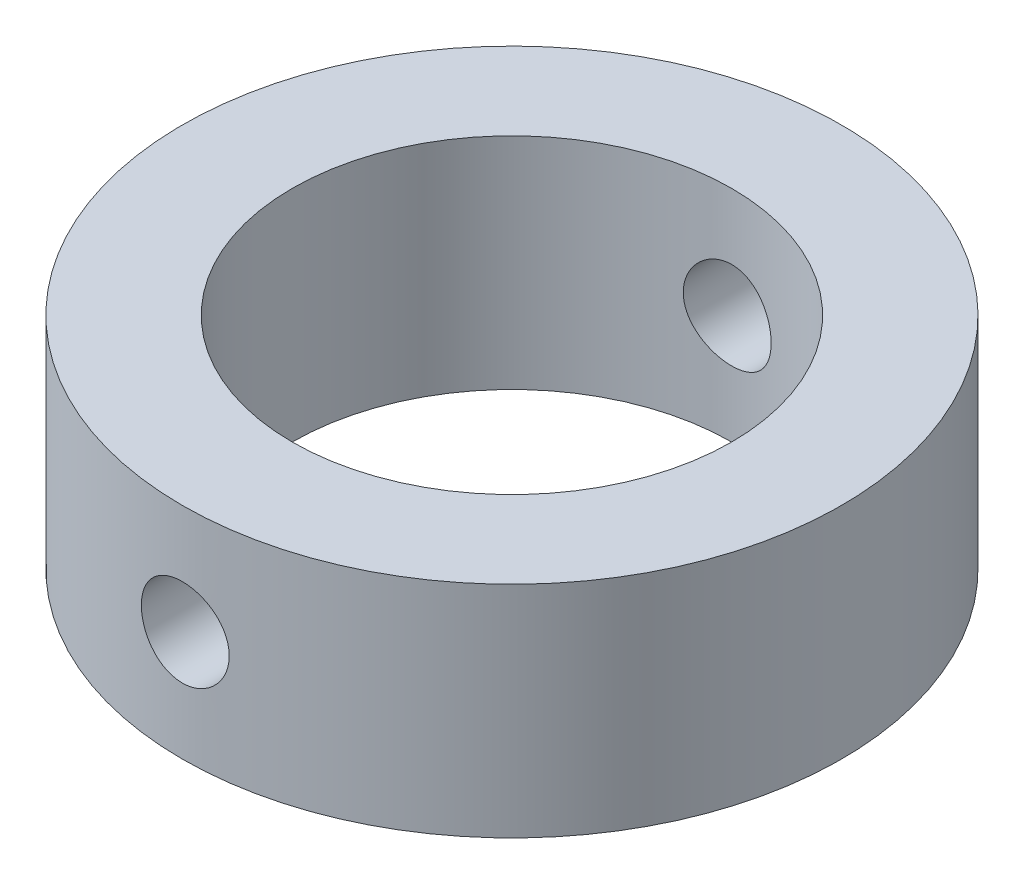
ISO-10303-21;
HEADER;
FILE_DESCRIPTION(('STEP AP214'),'2;1');
FILE_NAME('part.step','',(''),(''),'','','');
FILE_SCHEMA(('AUTOMOTIVE_DESIGN { 1 0 10303 214 1 1 1 1 }'));
ENDSEC;
DATA;
#1=APPLICATION_CONTEXT('core data for automotive mechanical design processes');
#2=APPLICATION_PROTOCOL_DEFINITION('international standard','automotive_design',2000,#1);
#3=PRODUCT_CONTEXT('',#1,'mechanical');
#4=PRODUCT('Part','Part','',(#3));
#5=PRODUCT_RELATED_PRODUCT_CATEGORY('part','',(#4));
#6=PRODUCT_DEFINITION_FORMATION('','',#4);
#7=PRODUCT_DEFINITION_CONTEXT('part definition',#1,'design');
#8=PRODUCT_DEFINITION('design','',#6,#7);
#9=PRODUCT_DEFINITION_SHAPE('','',#8);
#10=(LENGTH_UNIT() NAMED_UNIT(*) SI_UNIT(.MILLI.,.METRE.));
#11=(NAMED_UNIT(*) PLANE_ANGLE_UNIT() SI_UNIT($,.RADIAN.));
#12=(NAMED_UNIT(*) SI_UNIT($,.STERADIAN.) SOLID_ANGLE_UNIT());
#13=UNCERTAINTY_MEASURE_WITH_UNIT(LENGTH_MEASURE(1.E-05),#10,'distance_accuracy_value','');
#14=(GEOMETRIC_REPRESENTATION_CONTEXT(3) GLOBAL_UNCERTAINTY_ASSIGNED_CONTEXT((#13)) GLOBAL_UNIT_ASSIGNED_CONTEXT((#10,
#11,#12)) REPRESENTATION_CONTEXT('',''));
#15=CARTESIAN_POINT('',(0.,0.,0.));
#16=DIRECTION('',(0.,0.,1.));
#17=DIRECTION('',(1.,0.,0.));
#18=AXIS2_PLACEMENT_3D('',#15,#16,#17);
#19=CARTESIAN_POINT('',(0.,15.,0.));
#20=DIRECTION('',(0.,1.,0.));
#21=DIRECTION('',(0.,0.,1.));
#22=AXIS2_PLACEMENT_3D('',#19,#20,#21);
#23=PLANE('',#22);
#24=CARTESIAN_POINT('',(0.,15.,0.));
#25=DIRECTION('',(0.,1.,0.));
#26=DIRECTION('',(0.,0.,1.));
#27=AXIS2_PLACEMENT_3D('',#24,#25,#26);
#28=CIRCLE('',#27,22.5);
#29=CARTESIAN_POINT('',(0.,15.,22.5));
#30=VERTEX_POINT('',#29);
#31=EDGE_CURVE('E10',#30,#30,#28,.T.);
#32=ORIENTED_EDGE('',*,*,#31,.T.);
#33=EDGE_LOOP('',(#32));
#34=FACE_BOUND('',#33,.T.);
#35=CARTESIAN_POINT('',(0.,15.,0.));
#36=DIRECTION('',(0.,1.,0.));
#37=DIRECTION('',(0.,0.,1.));
#38=AXIS2_PLACEMENT_3D('',#35,#36,#37);
#39=CIRCLE('',#38,15.);
#40=CARTESIAN_POINT('',(0.,15.,15.));
#41=VERTEX_POINT('',#40);
#42=EDGE_CURVE('E64',#41,#41,#39,.T.);
#43=ORIENTED_EDGE('',*,*,#42,.F.);
#44=EDGE_LOOP('',(#43));
#45=FACE_BOUND('',#44,.T.);
#46=ADVANCED_FACE('F43',(#34,#45),#23,.T.);
#47=CARTESIAN_POINT('',(0.,0.,0.));
#48=DIRECTION('',(0.,1.,0.));
#49=DIRECTION('',(0.,0.,1.));
#50=AXIS2_PLACEMENT_3D('',#47,#48,#49);
#51=PLANE('',#50);
#52=CARTESIAN_POINT('',(0.,0.,0.));
#53=DIRECTION('',(0.,1.,0.));
#54=DIRECTION('',(0.,0.,1.));
#55=AXIS2_PLACEMENT_3D('',#52,#53,#54);
#56=CIRCLE('',#55,22.5);
#57=CARTESIAN_POINT('',(0.,0.,22.5));
#58=VERTEX_POINT('',#57);
#59=EDGE_CURVE('E58',#58,#58,#56,.T.);
#60=ORIENTED_EDGE('',*,*,#59,.F.);
#61=EDGE_LOOP('',(#60));
#62=FACE_BOUND('',#61,.T.);
#63=CARTESIAN_POINT('',(0.,0.,0.));
#64=DIRECTION('',(0.,1.,0.));
#65=DIRECTION('',(0.,0.,1.));
#66=AXIS2_PLACEMENT_3D('',#63,#64,#65);
#67=CIRCLE('',#66,15.);
#68=CARTESIAN_POINT('',(0.,0.,15.));
#69=VERTEX_POINT('',#68);
#70=EDGE_CURVE('E67',#69,#69,#67,.T.);
#71=ORIENTED_EDGE('',*,*,#70,.T.);
#72=EDGE_LOOP('',(#71));
#73=FACE_BOUND('',#72,.T.);
#74=ADVANCED_FACE('F108',(#62,#73),#51,.F.);
#75=CARTESIAN_POINT('',(0.,15.,0.));
#76=DIRECTION('',(0.,-1.,0.));
#77=DIRECTION('',(0.,0.,-1.));
#78=AXIS2_PLACEMENT_3D('',#75,#76,#77);
#79=CYLINDRICAL_SURFACE('',#78,22.5);
#80=CARTESIAN_POINT('',(0.,10.5,-22.5));
#81=CARTESIAN_POINT('',(-0.167713253503927,10.4999929354396,-22.4999975361382));
#82=CARTESIAN_POINT('',(-0.33552896891442,10.4858886930563,-22.4981050609079));
#83=CARTESIAN_POINT('',(-0.666484087707119,10.4298504764257,-22.4907376669036));
#84=CARTESIAN_POINT('',(-0.829618533499555,10.3878880576543,-22.4852590866259));
#85=CARTESIAN_POINT('',(-1.14637246894048,10.2773974236878,-22.471336197736));
#86=CARTESIAN_POINT('',(-1.29999852458774,10.2088877834423,-22.4628939631646));
#87=CARTESIAN_POINT('',(-1.59354584254545,10.0472896292906,-22.4439807999059));
#88=CARTESIAN_POINT('',(-1.73346930950554,9.95420507825031,-22.4335101983785));
#89=CARTESIAN_POINT('',(-1.99653873375702,9.74548010759372,-22.4116349218495));
#90=CARTESIAN_POINT('',(-2.1195869782438,9.62971703248729,-22.4002253724317));
#91=CARTESIAN_POINT('',(-2.34457103509653,9.37918471638502,-22.3777970633693));
#92=CARTESIAN_POINT('',(-2.44650572995832,9.24441447000629,-22.3667783244351));
#93=CARTESIAN_POINT('',(-2.62673853403361,8.95905131558245,-22.3463315316028));
#94=CARTESIAN_POINT('',(-2.70494411223867,8.80839947628206,-22.3369097664864));
#95=CARTESIAN_POINT('',(-2.83490767510935,8.49595339914482,-22.3207888106885));
#96=CARTESIAN_POINT('',(-2.88666679867917,8.33415964147003,-22.3140895027681));
#97=CARTESIAN_POINT('',(-2.96196910158261,8.00504128424751,-22.30421904853));
#98=CARTESIAN_POINT('',(-2.9856780634276,7.83775524820062,-22.301027180552));
#99=CARTESIAN_POINT('',(-3.00472020822176,7.50155073059107,-22.2984697741397));
#100=CARTESIAN_POINT('',(-3.00005468450402,7.33263232378365,-22.299104061306));
#101=CARTESIAN_POINT('',(-2.96261618908852,6.9991183049581,-22.3041083365948));
#102=CARTESIAN_POINT('',(-2.93002646297642,6.83450170517144,-22.3084539693351));
#103=CARTESIAN_POINT('',(-2.83795086951557,6.51309474485986,-22.3203532916212));
#104=CARTESIAN_POINT('',(-2.77846438892186,6.35630456286748,-22.3279070543119));
#105=CARTESIAN_POINT('',(-2.63408893714787,6.0544355479392,-22.3453989166654));
#106=CARTESIAN_POINT('',(-2.54912096870624,5.90939494320854,-22.3553444118585));
#107=CARTESIAN_POINT('',(-2.35625090016434,5.63556137712351,-22.376493543299));
#108=CARTESIAN_POINT('',(-2.24834760753577,5.50676926116875,-22.3876972449529));
#109=CARTESIAN_POINT('',(-2.01165735039543,5.26802548112715,-22.4102084885038));
#110=CARTESIAN_POINT('',(-1.88271256053967,5.15823023594651,-22.421516153118));
#111=CARTESIAN_POINT('',(-1.60814125520011,4.96181693260741,-22.442878857274));
#112=CARTESIAN_POINT('',(-1.46251469166355,4.87519894121472,-22.4529338932073));
#113=CARTESIAN_POINT('',(-1.1585883295957,4.72759632345789,-22.4706659061537));
#114=CARTESIAN_POINT('',(-1.00028336826184,4.66662220343053,-22.4783419081344));
#115=CARTESIAN_POINT('',(-0.675556386504372,4.57216602154148,-22.4904423885611));
#116=CARTESIAN_POINT('',(-0.509134799313384,4.53868249404091,-22.4948670403489));
#117=CARTESIAN_POINT('',(-0.174250354988463,4.50036235084332,-22.4999436206528));
#118=CARTESIAN_POINT('',(-0.00581255182056126,4.49531039732477,-22.5006239077357));
#119=CARTESIAN_POINT('',(0.329507425828079,4.51342749619077,-22.4982118730778));
#120=CARTESIAN_POINT('',(0.496389638018499,4.53659586267354,-22.495119643029));
#121=CARTESIAN_POINT('',(0.82322057335941,4.61031698007598,-22.4855276303715));
#122=CARTESIAN_POINT('',(0.98319302476807,4.66076635248323,-22.4790407145438));
#123=CARTESIAN_POINT('',(1.29240764819034,4.78750944890563,-22.4633851388143));
#124=CARTESIAN_POINT('',(1.44164941052346,4.86380415901988,-22.4542163765916));
#125=CARTESIAN_POINT('',(1.72612331792412,5.04058823337497,-22.4341475605511));
#126=CARTESIAN_POINT('',(1.86126872159491,5.14121604857,-22.4232377256857));
#127=CARTESIAN_POINT('',(2.11282942048785,5.36361499383638,-22.4009359306497));
#128=CARTESIAN_POINT('',(2.22924386493568,5.48538708377465,-22.3895439486093));
#129=CARTESIAN_POINT('',(2.44080824134647,5.74756971395933,-22.3674735371027));
#130=CARTESIAN_POINT('',(2.53581491413408,5.88809635010724,-22.3568002316295));
#131=CARTESIAN_POINT('',(2.70087526618221,6.18323911542139,-22.3374619950273));
#132=CARTESIAN_POINT('',(2.7709295026552,6.33785492986557,-22.3287970190518));
#133=CARTESIAN_POINT('',(2.88386754751119,6.65633586304154,-22.3144921767012));
#134=CARTESIAN_POINT('',(2.92683043270193,6.82017252781621,-22.308843513489));
#135=CARTESIAN_POINT('',(2.98462000715938,7.15281544819314,-22.3011862304744));
#136=CARTESIAN_POINT('',(2.99944820140173,7.32162143748666,-22.2991774159701));
#137=CARTESIAN_POINT('',(3.00051728709284,7.65798523628026,-22.2990334694317));
#138=CARTESIAN_POINT('',(2.98698328791739,7.82554236144636,-22.3008678342378));
#139=CARTESIAN_POINT('',(2.93219065030034,8.15597681265581,-22.308137758113));
#140=CARTESIAN_POINT('',(2.89093202224903,8.31885414045297,-22.3135733158325));
#141=CARTESIAN_POINT('',(2.78193465498311,8.63526552487738,-22.3274233540915));
#142=CARTESIAN_POINT('',(2.71420831228562,8.78880391667529,-22.335836439891));
#143=CARTESIAN_POINT('',(2.55422014139606,9.08237382573909,-22.3546956856923));
#144=CARTESIAN_POINT('',(2.46195783945643,9.22240508213407,-22.365141884949));
#145=CARTESIAN_POINT('',(2.25468672764262,9.48613447489262,-22.3869895077459));
#146=CARTESIAN_POINT('',(2.13951040840351,9.6097004216327,-22.3983975863112));
#147=CARTESIAN_POINT('',(1.89003254024735,9.83583482454232,-22.4208257850249));
#148=CARTESIAN_POINT('',(1.75572651109466,9.93839834812538,-22.4318458135347));
#149=CARTESIAN_POINT('',(1.47112948177923,10.1200007076998,-22.4523095270629));
#150=CARTESIAN_POINT('',(1.32077193111595,10.1989359998329,-22.4617461964033));
#151=CARTESIAN_POINT('',(1.00888861438099,10.3303208978176,-22.4779098098846));
#152=CARTESIAN_POINT('',(0.847375018454832,10.3827988629373,-22.4846396538647));
#153=CARTESIAN_POINT('',(0.570882612147626,10.4474220095778,-22.493035826149));
#154=CARTESIAN_POINT('',(0.457636622933667,10.4671098652855,-22.4956344545261));
#155=CARTESIAN_POINT('',(0.229609757424167,10.4934012212482,-22.4991173773616));
#156=CARTESIAN_POINT('',(0.11482889467686,10.5000048369204,-22.500001686942));
#157=CARTESIAN_POINT('',(0.,10.5,-22.5));
#158=B_SPLINE_CURVE_WITH_KNOTS('',3,(#80,#81,#82,#83,#84,#85,#86,#87,#88,#89,#90,#91,#92,#93,
#94,#95,#96,#97,#98,#99,#100,#101,#102,#103,#104,#105,#106,#107,#108,#109,#110,#111,#112,#113,
#114,#115,#116,#117,#118,#119,#120,#121,#122,#123,#124,#125,#126,#127,#128,#129,#130,#131,#132,
#133,#134,#135,#136,#137,#138,#139,#140,#141,#142,#143,#144,#145,#146,#147,#148,#149,#150,#151,
#152,#153,#154,#155,#156,#157),.UNSPECIFIED.,.T.,.F.,(4,2,2,2,2,2,2,2,2,2,2,2,2,2,2,2,2,2,2,2,2,
2,2,2,2,2,2,2,2,2,2,2,2,2,2,2,2,2,4),(0.,0.502720276958616,1.00595464632757,1.50883753924111,
2.01163938846052,2.51723967665338,3.02286671857254,3.53044082267472,4.03799306649307,
4.54253033871538,5.0470446138738,5.54827327647066,6.04951336763776,6.55232374706847,
7.05516027665696,7.56195816727274,8.06875751778444,8.57576430303808,9.08274405587614,
9.58587877488091,10.0890012653172,10.590230450947,11.0914787625532,11.5956491215483,
12.0998423738814,12.6073155680318,13.1147774290957,13.6207511210318,14.1266977467545,
14.6286439124494,15.1305898900312,15.6323010555393,16.1340219089385,16.6395550175266,
17.1452067187674,17.6530429001177,18.1603335748863,18.5045360857096,18.8487355602816),.UNSPECIFIED.);
#159=CARTESIAN_POINT('',(0.,10.5,-22.5));
#160=VERTEX_POINT('',#159);
#161=EDGE_CURVE('E94',#160,#160,#158,.T.);
#162=ORIENTED_EDGE('',*,*,#161,.T.);
#163=EDGE_LOOP('',(#162));
#164=FACE_BOUND('',#163,.T.);
#165=CARTESIAN_POINT('',(3.,7.5,22.2991031209778));
#166=CARTESIAN_POINT('',(2.99999292892183,7.33229421679777,22.2991056676806));
#167=CARTESIAN_POINT('',(2.98588990056203,7.16448595032542,22.3010154696116));
#168=CARTESIAN_POINT('',(2.92985694399183,6.83354630649642,22.3084447289533));
#169=CARTESIAN_POINT('',(2.88789854473666,6.67041989262426,22.3139678794925));
#170=CARTESIAN_POINT('',(2.77741966710399,6.35368294766046,22.3279873821811));
#171=CARTESIAN_POINT('',(2.70891795412568,6.20006578257344,22.3364816334313));
#172=CARTESIAN_POINT('',(2.54733847321029,5.90653338643568,22.3554837337772));
#173=CARTESIAN_POINT('',(2.45426464895203,5.76661596159296,22.3659912596801));
#174=CARTESIAN_POINT('',(2.24555055734277,5.50353981799729,22.3879106598111));
#175=CARTESIAN_POINT('',(2.12978523412289,5.38048070148092,22.399327327406));
#176=CARTESIAN_POINT('',(1.87924384308915,5.15547563181543,22.4217356438735));
#177=CARTESIAN_POINT('',(1.74446679970797,5.05353076278571,22.4327272708987));
#178=CARTESIAN_POINT('',(1.45909758739142,4.87328723742539,22.4530964964055));
#179=CARTESIAN_POINT('',(1.30844765656683,4.79507926606463,22.4624678475342));
#180=CARTESIAN_POINT('',(0.996005724056051,4.6651107537288,22.4784878012372));
#181=CARTESIAN_POINT('',(0.834214190883601,4.61334910143348,22.4851365182189));
#182=CARTESIAN_POINT('',(0.505103062521134,4.5380416356296,22.4949282929341));
#183=CARTESIAN_POINT('',(0.337822085204846,4.51432977748206,22.4980919730761));
#184=CARTESIAN_POINT('',(0.00162750345548461,4.49528008689477,22.5006277195728));
#185=CARTESIAN_POINT('',(-0.167286028083699,4.49994099339522,22.4999999544425));
#186=CARTESIAN_POINT('',(-0.500820186698653,4.53737209581142,22.4950401617536));
#187=CARTESIAN_POINT('',(-0.665461256042676,4.56996369711847,22.4907316700671));
#188=CARTESIAN_POINT('',(-0.986916184068831,4.66205149053226,22.4789208613843));
#189=CARTESIAN_POINT('',(-1.14372987681276,4.72154825275217,22.4714184767105));
#190=CARTESIAN_POINT('',(-1.44562771263619,4.86594516168273,22.4540222850625));
#191=CARTESIAN_POINT('',(-1.59067477402989,4.95092193477462,22.4441212821882));
#192=CARTESIAN_POINT('',(-1.86451753610218,5.14381088592428,22.4230342562856));
#193=CARTESIAN_POINT('',(-1.99331238880023,5.2517242599417,22.4118481662643));
#194=CARTESIAN_POINT('',(-2.23204509231808,5.4884217725384,22.3893388214349));
#195=CARTESIAN_POINT('',(-2.34182855029532,5.61736165229045,22.378015176366));
#196=CARTESIAN_POINT('',(-2.53822039585787,5.89191889705886,22.3565924815386));
#197=CARTESIAN_POINT('',(-2.6248286915453,6.03753632820445,22.3464934366361));
#198=CARTESIAN_POINT('',(-2.7724242912975,6.34146000052005,22.3286636450151));
#199=CARTESIAN_POINT('',(-2.8333981336006,6.49977285677773,22.3209341432218));
#200=CARTESIAN_POINT('',(-2.92785135067386,6.82451703095756,22.3087421319858));
#201=CARTESIAN_POINT('',(-2.96133224031215,6.99094790103985,22.3042794425424));
#202=CARTESIAN_POINT('',(-2.9996424115309,7.32583700250744,22.2991596751552));
#203=CARTESIAN_POINT('',(-3.00468946648218,7.4942698954988,22.2984736726744));
#204=CARTESIAN_POINT('',(-2.98656432283194,7.82957888415711,22.3009083644505));
#205=CARTESIAN_POINT('',(-2.96339281094665,7.99645501760918,22.3040289660712));
#206=CARTESIAN_POINT('',(-2.88967207555529,8.32325397960842,22.3136988065515));
#207=CARTESIAN_POINT('',(-2.8392292548504,8.48320123952716,22.3202347168148));
#208=CARTESIAN_POINT('',(-2.71250767620188,8.79236837017866,22.3359878852161));
#209=CARTESIAN_POINT('',(-2.63622789314074,8.94158781498558,22.3452052497426));
#210=CARTESIAN_POINT('',(-2.45946609625816,9.22604596566122,22.3653516992928));
#211=CARTESIAN_POINT('',(-2.35884184749451,9.36119557255235,22.376290706837));
#212=CARTESIAN_POINT('',(-2.13644748469198,9.61276640765563,22.3986171527477));
#213=CARTESIAN_POINT('',(-2.01467643215631,9.72918680422202,22.410004610999));
#214=CARTESIAN_POINT('',(-1.75249132253736,9.94076483088168,22.43203422983));
#215=CARTESIAN_POINT('',(-1.61196096139879,10.0357789745574,22.4426710507457));
#216=CARTESIAN_POINT('',(-1.31680867847643,10.200852423263,22.4619201221746));
#217=CARTESIAN_POINT('',(-1.16218707377055,10.2709122896342,22.4705324182274));
#218=CARTESIAN_POINT('',(-0.84370915878515,10.3838538923822,22.4847384703673));
#219=CARTESIAN_POINT('',(-0.679882176371044,10.4268171436253,22.4903412723117));
#220=CARTESIAN_POINT('',(-0.347259740134797,10.4846107281915,22.4979347502993));
#221=CARTESIAN_POINT('',(-0.178464543299732,10.4994425140616,22.499925612842));
#222=CARTESIAN_POINT('',(0.157904810567379,10.5005224008605,22.5000697087262));
#223=CARTESIAN_POINT('',(0.325478288882809,10.4869912058916,22.4982525737009));
#224=CARTESIAN_POINT('',(0.65594616457854,10.432198438152,22.4910439982984));
#225=CARTESIAN_POINT('',(0.818840568511611,10.390936904218,22.485652562927));
#226=CARTESIAN_POINT('',(1.13528735188325,10.2819269293851,22.4718983496352));
#227=CARTESIAN_POINT('',(1.28884395231572,10.2141905603882,22.4635369261179));
#228=CARTESIAN_POINT('',(1.58244611794646,10.0541766755311,22.4447662409466));
#229=CARTESIAN_POINT('',(1.72249143359931,9.96189870652016,22.4343569414803));
#230=CARTESIAN_POINT('',(1.98622092909954,9.75460997699573,22.4125543681221));
#231=CARTESIAN_POINT('',(2.10977573574388,9.63943531479568,22.4011543544026));
#232=CARTESIAN_POINT('',(2.33588843381036,9.38996539642449,22.3787079735476));
#233=CARTESIAN_POINT('',(2.43844136296137,9.25566563410142,22.3676616905097));
#234=CARTESIAN_POINT('',(2.62003186467116,8.97107408765783,22.3471216479154));
#235=CARTESIAN_POINT('',(2.69896410641011,8.82071461279206,22.337634925064));
#236=CARTESIAN_POINT('',(2.83034277419568,8.50882729878187,22.3213704974611));
#237=CARTESIAN_POINT('',(2.88281759498929,8.34731164537562,22.3145898900774));
#238=CARTESIAN_POINT('',(2.94743220568238,8.07082758190417,22.3061270075485));
#239=CARTESIAN_POINT('',(2.96711622203802,7.95759259054575,22.3035064293224));
#240=CARTESIAN_POINT('',(2.99340248014674,7.72958773579628,22.2999936221278));
#241=CARTESIAN_POINT('',(3.00000484113448,7.61481788640452,22.2991013774062));
#242=CARTESIAN_POINT('',(3.,7.5,22.2991031209778));
#243=B_SPLINE_CURVE_WITH_KNOTS('',3,(#165,#166,#167,#168,#169,#170,#171,#172,#173,#174,#175,
#176,#177,#178,#179,#180,#181,#182,#183,#184,#185,#186,#187,#188,#189,#190,#191,#192,#193,#194,
#195,#196,#197,#198,#199,#200,#201,#202,#203,#204,#205,#206,#207,#208,#209,#210,#211,#212,#213,
#214,#215,#216,#217,#218,#219,#220,#221,#222,#223,#224,#225,#226,#227,#228,#229,#230,#231,#232,
#233,#234,#235,#236,#237,#238,#239,#240,#241,#242),.UNSPECIFIED.,.T.,.F.,(4,2,2,2,2,2,2,2,2,2,2,
2,2,2,2,2,2,2,2,2,2,2,2,2,2,2,2,2,2,2,2,2,2,2,2,2,2,2,4),(0.,0.502697833875673,1.00591026915852,
1.50876759415237,2.01154426252434,2.51717392681748,3.02282954643357,3.5303933478772,
4.03793581885392,4.54245854287453,5.04695884297284,5.54825713004929,6.04956604000018,
6.55239792684377,7.05525603876943,7.56202372603438,8.06879342278637,8.57582891483611,
9.08283646723653,9.58595553872895,10.0890623667531,10.5902202722789,11.0913980642731,
11.595577922135,12.0997801612593,12.6072676764676,13.1147437751273,13.620685856555,
14.1266018133322,14.6285956478445,15.1305887793096,15.6323532802529,16.1341270467162,
16.6396311355341,17.145254526141,17.6531001297407,18.1603995347189,18.5045691141841,
18.8487355566505),.UNSPECIFIED.);
#244=CARTESIAN_POINT('',(3.,7.5,22.2991031209778));
#245=VERTEX_POINT('',#244);
#246=EDGE_CURVE('E88',#245,#245,#243,.T.);
#247=ORIENTED_EDGE('',*,*,#246,.T.);
#248=EDGE_LOOP('',(#247));
#249=FACE_BOUND('',#248,.T.);
#250=ORIENTED_EDGE('',*,*,#31,.F.);
#251=EDGE_LOOP('',(#250));
#252=FACE_BOUND('',#251,.T.);
#253=ORIENTED_EDGE('',*,*,#59,.T.);
#254=EDGE_LOOP('',(#253));
#255=FACE_BOUND('',#254,.T.);
#256=ADVANCED_FACE('F45',(#164,#249,#252,#255),#79,.T.);
#257=CARTESIAN_POINT('',(0.,15.,0.));
#258=DIRECTION('',(0.,-1.,0.));
#259=DIRECTION('',(0.,0.,-1.));
#260=AXIS2_PLACEMENT_3D('',#257,#258,#259);
#261=CYLINDRICAL_SURFACE('',#260,15.);
#262=CARTESIAN_POINT('',(0.,10.5,-15.));
#263=CARTESIAN_POINT('',(-0.1667307203779,10.499993866505,-14.9999969274261));
#264=CARTESIAN_POINT('',(-0.333538980604567,10.4860534710971,-14.9971915553469));
#265=CARTESIAN_POINT('',(-0.662440523067058,10.4307044996543,-14.9862709686969));
#266=CARTESIAN_POINT('',(-0.824529952624068,10.3892741015955,-14.9781515358056));
#267=CARTESIAN_POINT('',(-1.13919091578994,10.2802761791376,-14.9575094783486));
#268=CARTESIAN_POINT('',(-1.2917714037994,10.2127336894659,-14.9449910723015));
#269=CARTESIAN_POINT('',(-1.58342396659268,10.0535032574661,-14.9169119410594));
#270=CARTESIAN_POINT('',(-1.72249684522744,9.96181675317838,-14.9013513970712));
#271=CARTESIAN_POINT('',(-1.9850804319446,9.7555845171257,-14.8686649598991));
#272=CARTESIAN_POINT('',(-2.10838185347557,9.64077493382639,-14.8515223651304));
#273=CARTESIAN_POINT('',(-2.33411026982409,9.39212275082489,-14.8177254135776));
#274=CARTESIAN_POINT('',(-2.43653563431127,9.25827866599464,-14.8010710950127));
#275=CARTESIAN_POINT('',(-2.61849526004286,8.97385142096437,-14.7699732543785));
#276=CARTESIAN_POINT('',(-2.6978128165976,8.82312706861092,-14.7555512209484));
#277=CARTESIAN_POINT('',(-2.82991699974092,8.51015454298776,-14.7307880417525));
#278=CARTESIAN_POINT('',(-2.88270624731171,8.34790750996097,-14.7204464928588));
#279=CARTESIAN_POINT('',(-2.95957589965448,8.01874690827625,-14.7051841575661));
#280=CARTESIAN_POINT('',(-2.98402349387633,7.85192236757332,-14.7001941032156));
#281=CARTESIAN_POINT('',(-3.00465638317836,7.51647053590697,-14.6959912518188));
#282=CARTESIAN_POINT('',(-3.0008445681405,7.34784343103956,-14.6967778640352));
#283=CARTESIAN_POINT('',(-2.96536371930546,7.01625963593699,-14.7039765344455));
#284=CARTESIAN_POINT('',(-2.93411562073172,6.85325578311806,-14.7103035857629));
#285=CARTESIAN_POINT('',(-2.84531365386915,6.53485177001099,-14.7277363848));
#286=CARTESIAN_POINT('',(-2.78775852930204,6.37945197324298,-14.7388423607334));
#287=CARTESIAN_POINT('',(-2.64757435102416,6.0794542148892,-14.7646685550122));
#288=CARTESIAN_POINT('',(-2.56477845369634,5.93493636129248,-14.7794126944111));
#289=CARTESIAN_POINT('',(-2.37658072371804,5.66168745008156,-14.8108385631919));
#290=CARTESIAN_POINT('',(-2.27117629307049,5.53295820944653,-14.827520515151));
#291=CARTESIAN_POINT('',(-2.03849980368175,5.29251179262919,-14.8613106372439));
#292=CARTESIAN_POINT('',(-1.91086848363733,5.18114229642261,-14.8784210763271));
#293=CARTESIAN_POINT('',(-1.63855507218603,4.98133846109633,-14.9108654614323));
#294=CARTESIAN_POINT('',(-1.49387276213817,4.89290441611926,-14.9261993846692));
#295=CARTESIAN_POINT('',(-1.19117816063676,4.74141747232207,-14.9534007048266));
#296=CARTESIAN_POINT('',(-1.0331454587559,4.67840431906639,-14.9652626654482));
#297=CARTESIAN_POINT('',(-0.708446929345994,4.5799185778843,-14.9841422696357));
#298=CARTESIAN_POINT('',(-0.541782150217349,4.54444265377912,-14.9911605000159));
#299=CARTESIAN_POINT('',(-0.207538216881452,4.50253063861717,-14.999480156006));
#300=CARTESIAN_POINT('',(-0.0400209849767291,4.49561874137919,-15.0008752395741));
#301=CARTESIAN_POINT('',(0.293774802578142,4.50974957682654,-14.9980515579031));
#302=CARTESIAN_POINT('',(0.460053427331379,4.53079073805779,-14.9938331082434));
#303=CARTESIAN_POINT('',(0.785116979839622,4.59983512063187,-14.9803149602405));
#304=CARTESIAN_POINT('',(0.943955845019709,4.64759420549371,-14.9710612921262));
#305=CARTESIAN_POINT('',(1.251370882499,4.76845194796743,-14.948506561831));
#306=CARTESIAN_POINT('',(1.39994628491262,4.84155250403049,-14.9352051964268));
#307=CARTESIAN_POINT('',(1.68462352105865,5.01204747195394,-14.9057973459988));
#308=CARTESIAN_POINT('',(1.82055038025656,5.10972834311683,-14.8896585131116));
#309=CARTESIAN_POINT('',(2.07425405735762,5.32622757362184,-14.8564420448965));
#310=CARTESIAN_POINT('',(2.19202892679229,5.4450481991996,-14.8393643090516));
#311=CARTESIAN_POINT('',(2.40792177232253,5.70262005567337,-14.8058791067089));
#312=CARTESIAN_POINT('',(2.50571310734597,5.84164723266401,-14.7894858069991));
#313=CARTESIAN_POINT('',(2.67655626015362,6.13443408407004,-14.7595257538858));
#314=CARTESIAN_POINT('',(2.74960906776871,6.28819316872066,-14.7459588874003));
#315=CARTESIAN_POINT('',(2.86845552474588,6.60530473844864,-14.7233022175315));
#316=CARTESIAN_POINT('',(2.91439049937315,6.76860252363096,-14.7141892461656));
#317=CARTESIAN_POINT('',(2.97812595488159,7.10080036047271,-14.7014231037608));
#318=CARTESIAN_POINT('',(2.99593010467534,7.26969967862804,-14.6977692207333));
#319=CARTESIAN_POINT('',(3.00276273260241,7.60502659363295,-14.6963744889414));
#320=CARTESIAN_POINT('',(2.99230736421269,7.77144344678103,-14.698527575679));
#321=CARTESIAN_POINT('',(2.94405691230018,8.10009494971508,-14.7082672045384));
#322=CARTESIAN_POINT('',(2.90626204838789,8.26232963308441,-14.7158537030151));
#323=CARTESIAN_POINT('',(2.80463570549686,8.57768313372163,-14.7355579265748));
#324=CARTESIAN_POINT('',(2.74086752015203,8.73082308150725,-14.7476646305649));
#325=CARTESIAN_POINT('',(2.58916393380481,9.02431116220332,-14.7750514492251));
#326=CARTESIAN_POINT('',(2.50122650632465,9.16465822117541,-14.7903318299668));
#327=CARTESIAN_POINT('',(2.30191774435924,9.43114671645094,-14.8226688156968));
#328=CARTESIAN_POINT('',(2.19017366170554,9.55700629580279,-14.839751187291));
#329=CARTESIAN_POINT('',(1.94719310703942,9.78835861658751,-14.8735824561586));
#330=CARTESIAN_POINT('',(1.81595216146,9.89384667095182,-14.8903312758955));
#331=CARTESIAN_POINT('',(1.53605288726474,10.0825039318393,-14.9218149716391));
#332=CARTESIAN_POINT('',(1.3872266532895,10.1654280098401,-14.9365269365774));
#333=CARTESIAN_POINT('',(1.0774990828222,10.3049583677898,-14.96205375255));
#334=CARTESIAN_POINT('',(0.916608782589378,10.3615883685975,-14.9728721141585));
#335=CARTESIAN_POINT('',(0.629464466771339,10.4359558441341,-14.9872911778611));
#336=CARTESIAN_POINT('',(0.504844992041354,10.4599295811233,-14.9920290947535));
#337=CARTESIAN_POINT('',(0.253498575630201,10.4919537370751,-14.9983846241968));
#338=CARTESIAN_POINT('',(0.126771701245857,10.5000046635293,-15.0000023361946));
#339=CARTESIAN_POINT('',(0.,10.5,-15.));
#340=B_SPLINE_CURVE_WITH_KNOTS('',3,(#262,#263,#264,#265,#266,#267,#268,#269,#270,#271,#272,
#273,#274,#275,#276,#277,#278,#279,#280,#281,#282,#283,#284,#285,#286,#287,#288,#289,#290,#291,
#292,#293,#294,#295,#296,#297,#298,#299,#300,#301,#302,#303,#304,#305,#306,#307,#308,#309,#310,
#311,#312,#313,#314,#315,#316,#317,#318,#319,#320,#321,#322,#323,#324,#325,#326,#327,#328,#329,
#330,#331,#332,#333,#334,#335,#336,#337,#338,#339),.UNSPECIFIED.,.T.,.F.,(4,2,2,2,2,2,2,2,2,2,2,
2,2,2,2,2,2,2,2,2,2,2,2,2,2,2,2,2,2,2,2,2,2,2,2,2,2,2,4),(0.,0.499728391983775,0.99985395207397,
1.49950120575103,1.99911870669259,2.50479801033656,3.0105167902421,3.52083585017768,
4.03110448095592,4.53468555310762,5.03821512843675,5.53415181018835,6.03011217761189,
6.52942470610778,7.02879464249011,7.53714757474052,8.04550702619461,8.55465824562072,
9.06374777094108,9.56432207028795,10.064868229736,10.5609136185217,11.0569961764807,
11.5591519810008,12.0613616503779,12.5712188573768,13.081055661704,13.5882114309817,
14.0953010499124,14.593191677031,15.0910783047782,15.5877588375933,16.084481027456,
16.5896422871743,17.0949196359879,17.6054849002691,18.1155886655256,18.4955632586968,
18.8755257411299),.UNSPECIFIED.);
#341=CARTESIAN_POINT('',(0.,10.5,-15.));
#342=VERTEX_POINT('',#341);
#343=EDGE_CURVE('E48',#342,#342,#340,.T.);
#344=ORIENTED_EDGE('',*,*,#343,.F.);
#345=EDGE_LOOP('',(#344));
#346=FACE_BOUND('',#345,.T.);
#347=CARTESIAN_POINT('',(3.,7.5,14.6969384566991));
#348=CARTESIAN_POINT('',(2.99999383762581,7.33330687352653,14.6969417707994));
#349=CARTESIAN_POINT('',(2.98605951515443,7.16653612999998,14.6998052480611));
#350=CARTESIAN_POINT('',(2.93073685074852,6.8377124845706,14.7109329391462));
#351=CARTESIAN_POINT('',(2.88932654121148,6.67566346609206,14.7192014743436));
#352=CARTESIAN_POINT('',(2.78038734785924,6.36108808993737,14.7401662116556));
#353=CARTESIAN_POINT('',(2.71288444245786,6.20855243540223,14.7528580086323));
#354=CARTESIAN_POINT('',(2.55374732301151,5.91697546590913,14.7812339844198));
#355=CARTESIAN_POINT('',(2.46211445580345,5.77793339838629,14.7969179962038));
#356=CARTESIAN_POINT('',(2.25593722696031,5.51531698843842,14.8297589908276));
#357=CARTESIAN_POINT('',(2.14111696773996,5.39196123634808,14.8469321351174));
#358=CARTESIAN_POINT('',(1.89242036706393,5.16612739926306,14.880674169078));
#359=CARTESIAN_POINT('',(1.75854269093395,5.06365077774842,14.8972430163249));
#360=CARTESIAN_POINT('',(1.47408406777277,4.88163594711462,14.9280838925269));
#361=CARTESIAN_POINT('',(1.32336770301663,4.80230545855008,14.9423346432465));
#362=CARTESIAN_POINT('',(1.01041245116182,4.67017518885559,14.9667521065089));
#363=CARTESIAN_POINT('',(0.848174644261661,4.61737292429703,14.9769192013236));
#364=CARTESIAN_POINT('',(0.519050319835485,4.54047841914113,14.9919096206526));
#365=CARTESIAN_POINT('',(0.352253217644444,4.51601706728698,14.9968015886438));
#366=CARTESIAN_POINT('',(0.0168557053126107,4.49534714448505,15.0009276355081));
#367=CARTESIAN_POINT('',(-0.151744529495528,4.49913585106253,15.0001622595828));
#368=CARTESIAN_POINT('',(-0.483426002230764,4.53457854064666,14.9931130460555));
#369=CARTESIAN_POINT('',(-0.646551642895408,4.56583493150354,14.9869079509751));
#370=CARTESIAN_POINT('',(-0.965194879740902,4.65469509737668,14.9697653147823));
#371=CARTESIAN_POINT('',(-1.12071217124139,4.71229992657562,14.9588275843212));
#372=CARTESIAN_POINT('',(-1.42085838960266,4.8525901204418,14.9333188805988));
#373=CARTESIAN_POINT('',(-1.5654125224017,4.93543125331466,14.9187254452567));
#374=CARTESIAN_POINT('',(-1.83871513757927,5.1237272317098,14.8875140842136));
#375=CARTESIAN_POINT('',(-1.967461798575,5.22918467931155,14.8708959256567));
#376=CARTESIAN_POINT('',(-2.20785429316037,5.46190086632542,14.8371289309338));
#377=CARTESIAN_POINT('',(-2.31916294972089,5.58950756018877,14.8199758937255));
#378=CARTESIAN_POINT('',(-2.51885547953042,5.86174932735226,14.7873471479628));
#379=CARTESIAN_POINT('',(-2.60723891918325,6.00638472264959,14.7718714711364));
#380=CARTESIAN_POINT('',(-2.75868844440564,6.30906249546542,14.7443414241877));
#381=CARTESIAN_POINT('',(-2.82169994333313,6.46713290291899,14.7322944469065));
#382=CARTESIAN_POINT('',(-2.92017102488275,6.79191397117197,14.7130942896382));
#383=CARTESIAN_POINT('',(-2.95563419836993,6.95862350285725,14.7059404718528));
#384=CARTESIAN_POINT('',(-2.99749801810815,7.29289457399713,14.6974643780348));
#385=CARTESIAN_POINT('',(-3.00438557669374,7.46039272293102,14.6960444117146));
#386=CARTESIAN_POINT('',(-2.99021288493222,7.79414466959905,14.6989345706656));
#387=CARTESIAN_POINT('',(-2.96915421936733,7.96039853735659,14.7032443710116));
#388=CARTESIAN_POINT('',(-2.90010662422247,8.28530592087671,14.7170169748474));
#389=CARTESIAN_POINT('',(-2.8523778625179,8.44401702910729,14.7264299704349));
#390=CARTESIAN_POINT('',(-2.73162310592555,8.75118983708622,14.7493046805499));
#391=CARTESIAN_POINT('',(-2.65859502711953,8.89965069130716,14.7627667285881));
#392=CARTESIAN_POINT('',(-2.4882124266468,9.18423932985048,14.7924421788612));
#393=CARTESIAN_POINT('',(-2.39055323394826,9.32018113890248,14.8086891559471));
#394=CARTESIAN_POINT('',(-2.17408671663814,9.57392493600274,14.8420117147991));
#395=CARTESIAN_POINT('',(-2.05527721543361,9.69172505474776,14.8590873817145));
#396=CARTESIAN_POINT('',(-1.79769682049367,9.90768767755673,14.8924603760765));
#397=CARTESIAN_POINT('',(-1.65864749678889,10.00552096395,14.9087417312605));
#398=CARTESIAN_POINT('',(-1.36580368990427,10.1764376444987,14.9384138288586));
#399=CARTESIAN_POINT('',(-1.21200982630052,10.2495220780343,14.9518046926563));
#400=CARTESIAN_POINT('',(-0.894908042472042,10.3683866152399,14.974118821832));
#401=CARTESIAN_POINT('',(-0.731660020434239,10.4143215546788,14.9830673742781));
#402=CARTESIAN_POINT('',(-0.399568364039739,10.4780737429915,14.9955970781298));
#403=CARTESIAN_POINT('',(-0.230725406133638,10.495894378427,14.9991788759955));
#404=CARTESIAN_POINT('',(0.104618681710861,10.5027809428887,15.0005562136234));
#405=CARTESIAN_POINT('',(0.271109436424479,10.4923418413687,14.9984513564799));
#406=CARTESIAN_POINT('',(0.599913093946948,10.4440981483565,14.9889013068102));
#407=CARTESIAN_POINT('',(0.762226049261166,10.4062939009556,14.9814561814329));
#408=CARTESIAN_POINT('',(1.07775824923519,10.3046130237252,14.9620649509476));
#409=CARTESIAN_POINT('',(1.23099732972049,10.2407958656071,14.9501291174284));
#410=CARTESIAN_POINT('',(1.52466366055821,10.0889632760067,14.9230416637104));
#411=CARTESIAN_POINT('',(1.66508989730354,10.0009459322865,14.9078897894096));
#412=CARTESIAN_POINT('',(1.93159167031775,9.80154183881615,14.8757279747022));
#413=CARTESIAN_POINT('',(2.05739914834453,9.68980099084868,14.858692002537));
#414=CARTESIAN_POINT('',(2.28864785327552,9.44684927970369,14.8248366872359));
#415=CARTESIAN_POINT('',(2.39408424962674,9.31563381156023,14.8080173963616));
#416=CARTESIAN_POINT('',(2.58267665834995,9.03576204992871,14.7763002820179));
#417=CARTESIAN_POINT('',(2.66558044385427,8.88693311663624,14.7614251071368));
#418=CARTESIAN_POINT('',(2.80507214779868,8.5772016802197,14.7355571137924));
#419=CARTESIAN_POINT('',(2.86168393792249,8.41631028393843,14.7245607757495));
#420=CARTESIAN_POINT('',(2.93600741957297,8.12921263367138,14.7098904341354));
#421=CARTESIAN_POINT('',(2.95996169557105,8.00464374145813,14.7050635474382));
#422=CARTESIAN_POINT('',(2.99196005387913,7.75339813634659,14.6985863537725));
#423=CARTESIAN_POINT('',(3.00000468468793,7.62672149626659,14.6969359372925));
#424=CARTESIAN_POINT('',(3.,7.5,14.6969384566991));
#425=B_SPLINE_CURVE_WITH_KNOTS('',3,(#347,#348,#349,#350,#351,#352,#353,#354,#355,#356,#357,
#358,#359,#360,#361,#362,#363,#364,#365,#366,#367,#368,#369,#370,#371,#372,#373,#374,#375,#376,
#377,#378,#379,#380,#381,#382,#383,#384,#385,#386,#387,#388,#389,#390,#391,#392,#393,#394,#395,
#396,#397,#398,#399,#400,#401,#402,#403,#404,#405,#406,#407,#408,#409,#410,#411,#412,#413,#414,
#415,#416,#417,#418,#419,#420,#421,#422,#423,#424),.UNSPECIFIED.,.T.,.F.,(4,2,2,2,2,2,2,2,2,2,2,
2,2,2,2,2,2,2,2,2,2,2,2,2,2,2,2,2,2,2,2,2,2,2,2,2,2,2,4),(0.,0.499615391608283,
0.999630717852889,1.49914949382176,1.99864039457959,2.5044675764531,3.01033020106266,
3.5206020131235,4.03082604739679,4.53432746649241,5.03778036348745,5.53406368900612,
6.03036687221251,6.5297977266691,7.02928607310198,7.5374804028745,8.04568434368161,
8.5549758951833,9.06420105048074,9.5647127341378,10.0651960358526,10.5608802534996,
11.0566053106319,11.5587917932356,12.0610299861063,12.5709780520035,13.0809046989031,
13.5878944073595,14.0948230407488,14.5929305224406,15.0910317410027,15.5880005122635,
16.0850085640405,16.5900345607679,17.0951801666934,17.6057669573882,18.1158892527059,
18.4957141091448,18.8755258705644),.UNSPECIFIED.);
#426=CARTESIAN_POINT('',(3.,7.5,14.6969384566991));
#427=VERTEX_POINT('',#426);
#428=EDGE_CURVE('E69',#427,#427,#425,.T.);
#429=ORIENTED_EDGE('',*,*,#428,.F.);
#430=EDGE_LOOP('',(#429));
#431=FACE_BOUND('',#430,.T.);
#432=ORIENTED_EDGE('',*,*,#42,.T.);
#433=EDGE_LOOP('',(#432));
#434=FACE_BOUND('',#433,.T.);
#435=ORIENTED_EDGE('',*,*,#70,.F.);
#436=EDGE_LOOP('',(#435));
#437=FACE_BOUND('',#436,.T.);
#438=ADVANCED_FACE('F75',(#346,#431,#434,#437),#261,.F.);
#439=CARTESIAN_POINT('',(0.,7.5,-22.5));
#440=DIRECTION('',(0.,0.,1.));
#441=DIRECTION('',(1.,0.,0.));
#442=AXIS2_PLACEMENT_3D('',#439,#440,#441);
#443=CYLINDRICAL_SURFACE('',#442,3.);
#444=ORIENTED_EDGE('',*,*,#428,.T.);
#445=EDGE_LOOP('',(#444));
#446=FACE_BOUND('',#445,.T.);
#447=ORIENTED_EDGE('',*,*,#246,.F.);
#448=EDGE_LOOP('',(#447));
#449=FACE_BOUND('',#448,.T.);
#450=ADVANCED_FACE('F81',(#446,#449),#443,.F.);
#451=ORIENTED_EDGE('',*,*,#343,.T.);
#452=EDGE_LOOP('',(#451));
#453=FACE_BOUND('',#452,.T.);
#454=ORIENTED_EDGE('',*,*,#161,.F.);
#455=EDGE_LOOP('',(#454));
#456=FACE_BOUND('',#455,.T.);
#457=ADVANCED_FACE('F78',(#453,#456),#443,.F.);
#458=CLOSED_SHELL('',(#46,#74,#256,#438,#450,#457));
#459=MANIFOLD_SOLID_BREP('B2',#458);
#460=ADVANCED_BREP_SHAPE_REPRESENTATION('',(#18,#459),#14);
#461=SHAPE_DEFINITION_REPRESENTATION(#9,#460);
ENDSEC;
END-ISO-10303-21;
